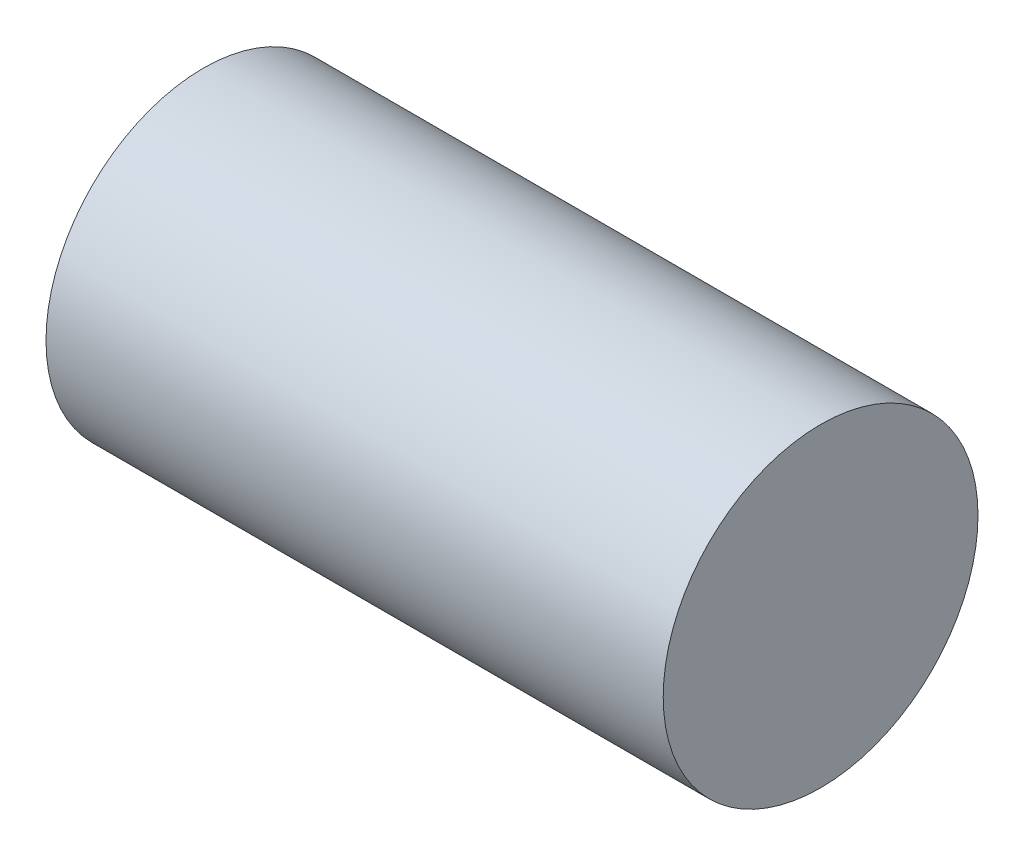
ISO-10303-21;
HEADER;
FILE_DESCRIPTION(('STEP AP214'),'2;1');
FILE_NAME('part.step','',(''),(''),'','','');
FILE_SCHEMA(('AUTOMOTIVE_DESIGN { 1 0 10303 214 1 1 1 1 }'));
ENDSEC;
DATA;
#1=APPLICATION_CONTEXT('core data for automotive mechanical design processes');
#2=APPLICATION_PROTOCOL_DEFINITION('international standard','automotive_design',2000,#1);
#3=PRODUCT_CONTEXT('',#1,'mechanical');
#4=PRODUCT('Part','Part','',(#3));
#5=PRODUCT_RELATED_PRODUCT_CATEGORY('part','',(#4));
#6=PRODUCT_DEFINITION_FORMATION('','',#4);
#7=PRODUCT_DEFINITION_CONTEXT('part definition',#1,'design');
#8=PRODUCT_DEFINITION('design','',#6,#7);
#9=PRODUCT_DEFINITION_SHAPE('','',#8);
#10=(LENGTH_UNIT() NAMED_UNIT(*) SI_UNIT(.MILLI.,.METRE.));
#11=(NAMED_UNIT(*) PLANE_ANGLE_UNIT() SI_UNIT($,.RADIAN.));
#12=(NAMED_UNIT(*) SI_UNIT($,.STERADIAN.) SOLID_ANGLE_UNIT());
#13=UNCERTAINTY_MEASURE_WITH_UNIT(LENGTH_MEASURE(1.E-05),#10,'distance_accuracy_value','');
#14=(GEOMETRIC_REPRESENTATION_CONTEXT(3) GLOBAL_UNCERTAINTY_ASSIGNED_CONTEXT((#13)) GLOBAL_UNIT_ASSIGNED_CONTEXT((#10,
#11,#12)) REPRESENTATION_CONTEXT('',''));
#15=CARTESIAN_POINT('',(0.,0.,0.));
#16=DIRECTION('',(0.,0.,1.));
#17=DIRECTION('',(1.,0.,0.));
#18=AXIS2_PLACEMENT_3D('',#15,#16,#17);
#19=CARTESIAN_POINT('',(25.4,0.,0.));
#20=DIRECTION('',(-1.,0.,0.));
#21=DIRECTION('',(0.,0.,1.));
#22=AXIS2_PLACEMENT_3D('',#19,#20,#21);
#23=CYLINDRICAL_SURFACE('',#22,6.477);
#24=CARTESIAN_POINT('',(25.4,0.,0.));
#25=DIRECTION('',(1.,0.,0.));
#26=DIRECTION('',(0.,0.,-1.));
#27=AXIS2_PLACEMENT_3D('',#24,#25,#26);
#28=CIRCLE('',#27,6.477);
#29=CARTESIAN_POINT('',(25.4,0.,-6.477));
#30=VERTEX_POINT('',#29);
#31=EDGE_CURVE('E10',#30,#30,#28,.T.);
#32=ORIENTED_EDGE('',*,*,#31,.F.);
#33=EDGE_LOOP('',(#32));
#34=FACE_BOUND('',#33,.T.);
#35=CARTESIAN_POINT('',(0.,0.,0.));
#36=DIRECTION('',(1.,0.,0.));
#37=DIRECTION('',(0.,0.,-1.));
#38=AXIS2_PLACEMENT_3D('',#35,#36,#37);
#39=CIRCLE('',#38,6.477);
#40=CARTESIAN_POINT('',(0.,0.,-6.477));
#41=VERTEX_POINT('',#40);
#42=EDGE_CURVE('E45',#41,#41,#39,.T.);
#43=ORIENTED_EDGE('',*,*,#42,.T.);
#44=EDGE_LOOP('',(#43));
#45=FACE_BOUND('',#44,.T.);
#46=ADVANCED_FACE('F39',(#34,#45),#23,.T.);
#47=CARTESIAN_POINT('',(25.4,0.,0.));
#48=DIRECTION('',(1.,0.,0.));
#49=DIRECTION('',(0.,0.,-1.));
#50=AXIS2_PLACEMENT_3D('',#47,#48,#49);
#51=PLANE('',#50);
#52=ORIENTED_EDGE('',*,*,#31,.T.);
#53=EDGE_LOOP('',(#52));
#54=FACE_BOUND('',#53,.T.);
#55=ADVANCED_FACE('F53',(#54),#51,.T.);
#56=CARTESIAN_POINT('',(0.,0.,0.));
#57=DIRECTION('',(1.,0.,0.));
#58=DIRECTION('',(0.,0.,-1.));
#59=AXIS2_PLACEMENT_3D('',#56,#57,#58);
#60=PLANE('',#59);
#61=ORIENTED_EDGE('',*,*,#42,.F.);
#62=EDGE_LOOP('',(#61));
#63=FACE_BOUND('',#62,.T.);
#64=ADVANCED_FACE('F55',(#63),#60,.F.);
#65=CLOSED_SHELL('',(#46,#55,#64));
#66=MANIFOLD_SOLID_BREP('B2',#65);
#67=ADVANCED_BREP_SHAPE_REPRESENTATION('',(#18,#66),#14);
#68=SHAPE_DEFINITION_REPRESENTATION(#9,#67);
ENDSEC;
END-ISO-10303-21;
